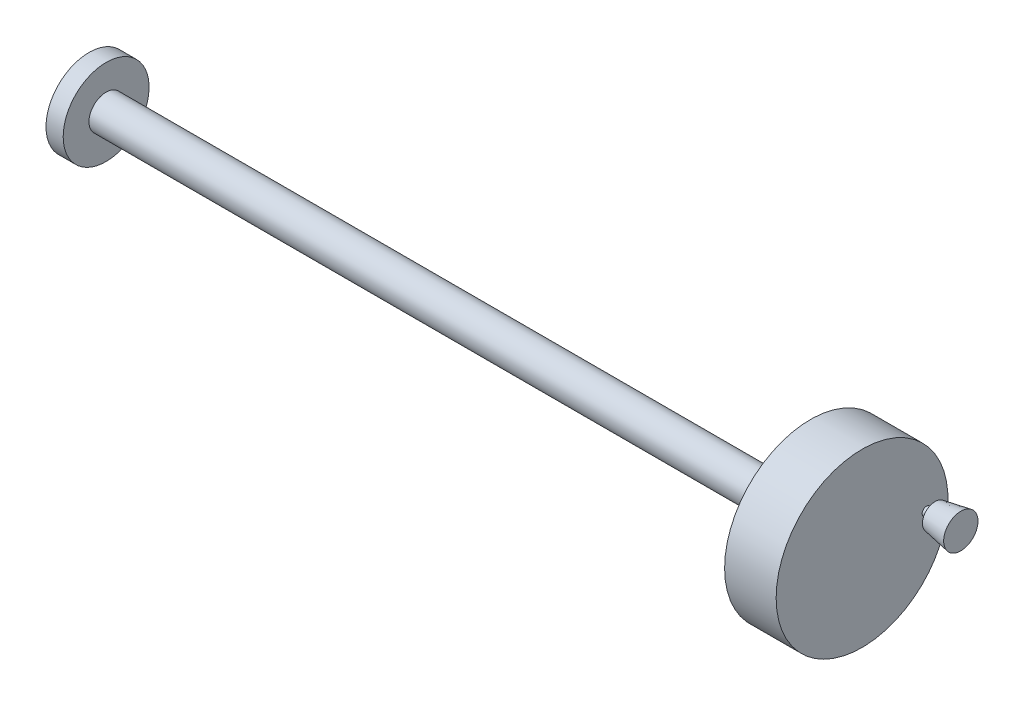
ISO-10303-21;
HEADER;
FILE_DESCRIPTION(('STEP AP214'),'2;1');
FILE_NAME('part.step','',(''),(''),'','','');
FILE_SCHEMA(('AUTOMOTIVE_DESIGN { 1 0 10303 214 1 1 1 1 }'));
ENDSEC;
DATA;
#1=APPLICATION_CONTEXT('core data for automotive mechanical design processes');
#2=APPLICATION_PROTOCOL_DEFINITION('international standard','automotive_design',2000,#1);
#3=PRODUCT_CONTEXT('',#1,'mechanical');
#4=PRODUCT('Part','Part','',(#3));
#5=PRODUCT_RELATED_PRODUCT_CATEGORY('part','',(#4));
#6=PRODUCT_DEFINITION_FORMATION('','',#4);
#7=PRODUCT_DEFINITION_CONTEXT('part definition',#1,'design');
#8=PRODUCT_DEFINITION('design','',#6,#7);
#9=PRODUCT_DEFINITION_SHAPE('','',#8);
#10=(LENGTH_UNIT() NAMED_UNIT(*) SI_UNIT(.MILLI.,.METRE.));
#11=(NAMED_UNIT(*) PLANE_ANGLE_UNIT() SI_UNIT($,.RADIAN.));
#12=(NAMED_UNIT(*) SI_UNIT($,.STERADIAN.) SOLID_ANGLE_UNIT());
#13=UNCERTAINTY_MEASURE_WITH_UNIT(LENGTH_MEASURE(1.E-05),#10,'distance_accuracy_value','');
#14=(GEOMETRIC_REPRESENTATION_CONTEXT(3) GLOBAL_UNCERTAINTY_ASSIGNED_CONTEXT((#13)) GLOBAL_UNIT_ASSIGNED_CONTEXT((#10,
#11,#12)) REPRESENTATION_CONTEXT('',''));
#15=CARTESIAN_POINT('',(0.,0.,0.));
#16=DIRECTION('',(0.,0.,1.));
#17=DIRECTION('',(1.,0.,0.));
#18=AXIS2_PLACEMENT_3D('',#15,#16,#17);
#19=CARTESIAN_POINT('',(330.2,0.,-47.625));
#20=DIRECTION('',(-1.,0.,0.));
#21=DIRECTION('',(0.,0.,1.));
#22=AXIS2_PLACEMENT_3D('',#19,#20,#21);
#23=CYLINDRICAL_SURFACE('',#22,3.175);
#24=CARTESIAN_POINT('',(304.8,0.,-47.625));
#25=DIRECTION('',(-1.,0.,0.));
#26=DIRECTION('',(0.,0.,1.));
#27=AXIS2_PLACEMENT_3D('',#24,#25,#26);
#28=CIRCLE('',#27,3.175);
#29=CARTESIAN_POINT('',(304.8,0.,-44.45));
#30=VERTEX_POINT('',#29);
#31=EDGE_CURVE('E37',#30,#30,#28,.F.);
#32=ORIENTED_EDGE('',*,*,#31,.T.);
#33=EDGE_LOOP('',(#32));
#34=FACE_BOUND('',#33,.T.);
#35=CARTESIAN_POINT('',(311.15,0.,-47.625));
#36=DIRECTION('',(1.,0.,0.));
#37=DIRECTION('',(0.,0.,-1.));
#38=AXIS2_PLACEMENT_3D('',#35,#36,#37);
#39=CIRCLE('',#38,3.175);
#40=CARTESIAN_POINT('',(311.15,0.,-50.8));
#41=VERTEX_POINT('',#40);
#42=EDGE_CURVE('E10',#41,#41,#39,.T.);
#43=ORIENTED_EDGE('',*,*,#42,.F.);
#44=EDGE_LOOP('',(#43));
#45=FACE_BOUND('',#44,.T.);
#46=ADVANCED_FACE('F30',(#34,#45),#23,.T.);
#47=CARTESIAN_POINT('',(304.8,0.,0.));
#48=DIRECTION('',(-1.,0.,0.));
#49=DIRECTION('',(0.,0.,1.));
#50=AXIS2_PLACEMENT_3D('',#47,#48,#49);
#51=PLANE('',#50);
#52=CARTESIAN_POINT('',(304.8,0.,0.));
#53=DIRECTION('',(-1.,0.,0.));
#54=DIRECTION('',(0.,0.,1.));
#55=AXIS2_PLACEMENT_3D('',#52,#53,#54);
#56=CIRCLE('',#55,63.5);
#57=CARTESIAN_POINT('',(304.8,0.,63.5));
#58=VERTEX_POINT('',#57);
#59=EDGE_CURVE('E41',#58,#58,#56,.T.);
#60=ORIENTED_EDGE('',*,*,#59,.F.);
#61=EDGE_LOOP('',(#60));
#62=FACE_BOUND('',#61,.T.);
#63=ORIENTED_EDGE('',*,*,#31,.F.);
#64=EDGE_LOOP('',(#63));
#65=FACE_BOUND('',#64,.T.);
#66=ADVANCED_FACE('F93',(#62,#65),#51,.F.);
#67=CARTESIAN_POINT('',(-266.7,0.,-31.75));
#68=DIRECTION('',(1.,0.,0.));
#69=DIRECTION('',(0.,0.,-1.));
#70=AXIS2_PLACEMENT_3D('',#67,#68,#69);
#71=PLANE('',#70);
#72=CARTESIAN_POINT('',(-266.7,0.,0.));
#73=DIRECTION('',(-1.,0.,0.));
#74=DIRECTION('',(0.,0.,1.));
#75=AXIS2_PLACEMENT_3D('',#72,#73,#74);
#76=CIRCLE('',#75,31.75);
#77=CARTESIAN_POINT('',(-266.7,0.,31.75));
#78=VERTEX_POINT('',#77);
#79=EDGE_CURVE('E65',#78,#78,#76,.T.);
#80=ORIENTED_EDGE('',*,*,#79,.T.);
#81=EDGE_LOOP('',(#80));
#82=FACE_BOUND('',#81,.T.);
#83=ADVANCED_FACE('F32',(#82),#71,.F.);
#84=CARTESIAN_POINT('',(-266.7,0.,0.));
#85=DIRECTION('',(-1.,0.,0.));
#86=DIRECTION('',(0.,0.,1.));
#87=AXIS2_PLACEMENT_3D('',#84,#85,#86);
#88=CYLINDRICAL_SURFACE('',#87,63.5);
#89=CARTESIAN_POINT('',(266.7,0.,0.));
#90=DIRECTION('',(-1.,0.,0.));
#91=DIRECTION('',(0.,0.,1.));
#92=AXIS2_PLACEMENT_3D('',#89,#90,#91);
#93=CIRCLE('',#92,63.5);
#94=CARTESIAN_POINT('',(266.7,0.,63.5));
#95=VERTEX_POINT('',#94);
#96=EDGE_CURVE('E45',#95,#95,#93,.T.);
#97=ORIENTED_EDGE('',*,*,#96,.F.);
#98=EDGE_LOOP('',(#97));
#99=FACE_BOUND('',#98,.T.);
#100=ORIENTED_EDGE('',*,*,#59,.T.);
#101=EDGE_LOOP('',(#100));
#102=FACE_BOUND('',#101,.T.);
#103=ADVANCED_FACE('F124',(#99,#102),#88,.T.);
#104=CARTESIAN_POINT('',(266.7,0.,-63.5));
#105=DIRECTION('',(1.,0.,0.));
#106=DIRECTION('',(0.,0.,-1.));
#107=AXIS2_PLACEMENT_3D('',#104,#105,#106);
#108=PLANE('',#107);
#109=CARTESIAN_POINT('',(266.7,0.,0.));
#110=DIRECTION('',(-1.,0.,0.));
#111=DIRECTION('',(0.,0.,1.));
#112=AXIS2_PLACEMENT_3D('',#109,#110,#111);
#113=CIRCLE('',#112,25.4);
#114=CARTESIAN_POINT('',(266.7,0.,25.4));
#115=VERTEX_POINT('',#114);
#116=EDGE_CURVE('E50',#115,#115,#113,.T.);
#117=ORIENTED_EDGE('',*,*,#116,.F.);
#118=EDGE_LOOP('',(#117));
#119=FACE_BOUND('',#118,.T.);
#120=ORIENTED_EDGE('',*,*,#96,.T.);
#121=EDGE_LOOP('',(#120));
#122=FACE_BOUND('',#121,.T.);
#123=ADVANCED_FACE('F120',(#119,#122),#108,.F.);
#124=CARTESIAN_POINT('',(-266.7,0.,0.));
#125=DIRECTION('',(-1.,0.,0.));
#126=DIRECTION('',(0.,0.,1.));
#127=AXIS2_PLACEMENT_3D('',#124,#125,#126);
#128=CYLINDRICAL_SURFACE('',#127,25.4);
#129=CARTESIAN_POINT('',(254.,0.,0.));
#130=DIRECTION('',(-1.,0.,0.));
#131=DIRECTION('',(0.,0.,1.));
#132=AXIS2_PLACEMENT_3D('',#129,#130,#131);
#133=CIRCLE('',#132,25.4);
#134=CARTESIAN_POINT('',(254.,0.,25.4));
#135=VERTEX_POINT('',#134);
#136=EDGE_CURVE('E53',#135,#135,#133,.T.);
#137=ORIENTED_EDGE('',*,*,#136,.F.);
#138=EDGE_LOOP('',(#137));
#139=FACE_BOUND('',#138,.T.);
#140=ORIENTED_EDGE('',*,*,#116,.T.);
#141=EDGE_LOOP('',(#140));
#142=FACE_BOUND('',#141,.T.);
#143=ADVANCED_FACE('F116',(#139,#142),#128,.T.);
#144=CARTESIAN_POINT('',(254.,0.,-25.4));
#145=DIRECTION('',(1.,0.,0.));
#146=DIRECTION('',(0.,0.,-1.));
#147=AXIS2_PLACEMENT_3D('',#144,#145,#146);
#148=PLANE('',#147);
#149=CARTESIAN_POINT('',(254.,0.,0.));
#150=DIRECTION('',(-1.,0.,0.));
#151=DIRECTION('',(0.,0.,1.));
#152=AXIS2_PLACEMENT_3D('',#149,#150,#151);
#153=CIRCLE('',#152,12.7);
#154=CARTESIAN_POINT('',(254.,0.,12.7));
#155=VERTEX_POINT('',#154);
#156=EDGE_CURVE('E56',#155,#155,#153,.T.);
#157=ORIENTED_EDGE('',*,*,#156,.F.);
#158=EDGE_LOOP('',(#157));
#159=FACE_BOUND('',#158,.T.);
#160=ORIENTED_EDGE('',*,*,#136,.T.);
#161=EDGE_LOOP('',(#160));
#162=FACE_BOUND('',#161,.T.);
#163=ADVANCED_FACE('F112',(#159,#162),#148,.F.);
#164=CARTESIAN_POINT('',(-266.7,0.,0.));
#165=DIRECTION('',(-1.,0.,0.));
#166=DIRECTION('',(0.,0.,1.));
#167=AXIS2_PLACEMENT_3D('',#164,#165,#166);
#168=CYLINDRICAL_SURFACE('',#167,12.7);
#169=CARTESIAN_POINT('',(-254.,0.,0.));
#170=DIRECTION('',(-1.,0.,0.));
#171=DIRECTION('',(0.,0.,1.));
#172=AXIS2_PLACEMENT_3D('',#169,#170,#171);
#173=CIRCLE('',#172,12.6999999999999);
#174=CARTESIAN_POINT('',(-254.,0.,12.6999999999999));
#175=VERTEX_POINT('',#174);
#176=EDGE_CURVE('E59',#175,#175,#173,.T.);
#177=ORIENTED_EDGE('',*,*,#176,.F.);
#178=EDGE_LOOP('',(#177));
#179=FACE_BOUND('',#178,.T.);
#180=ORIENTED_EDGE('',*,*,#156,.T.);
#181=EDGE_LOOP('',(#180));
#182=FACE_BOUND('',#181,.T.);
#183=ADVANCED_FACE('F108',(#179,#182),#168,.T.);
#184=CARTESIAN_POINT('',(-254.,0.,-12.6999999999999));
#185=DIRECTION('',(-1.,0.,0.));
#186=DIRECTION('',(0.,0.,1.));
#187=AXIS2_PLACEMENT_3D('',#184,#185,#186);
#188=PLANE('',#187);
#189=CARTESIAN_POINT('',(-254.,0.,0.));
#190=DIRECTION('',(-1.,0.,0.));
#191=DIRECTION('',(0.,0.,1.));
#192=AXIS2_PLACEMENT_3D('',#189,#190,#191);
#193=CIRCLE('',#192,31.75);
#194=CARTESIAN_POINT('',(-254.,0.,31.75));
#195=VERTEX_POINT('',#194);
#196=EDGE_CURVE('E62',#195,#195,#193,.T.);
#197=ORIENTED_EDGE('',*,*,#196,.F.);
#198=EDGE_LOOP('',(#197));
#199=FACE_BOUND('',#198,.T.);
#200=ORIENTED_EDGE('',*,*,#176,.T.);
#201=EDGE_LOOP('',(#200));
#202=FACE_BOUND('',#201,.T.);
#203=ADVANCED_FACE('F104',(#199,#202),#188,.F.);
#204=CARTESIAN_POINT('',(-266.7,0.,0.));
#205=DIRECTION('',(-1.,0.,0.));
#206=DIRECTION('',(0.,0.,1.));
#207=AXIS2_PLACEMENT_3D('',#204,#205,#206);
#208=CYLINDRICAL_SURFACE('',#207,31.75);
#209=ORIENTED_EDGE('',*,*,#79,.F.);
#210=EDGE_LOOP('',(#209));
#211=FACE_BOUND('',#210,.T.);
#212=ORIENTED_EDGE('',*,*,#196,.T.);
#213=EDGE_LOOP('',(#212));
#214=FACE_BOUND('',#213,.T.);
#215=ADVANCED_FACE('F89',(#211,#214),#208,.T.);
#216=CARTESIAN_POINT('',(311.15,0.,-47.625));
#217=DIRECTION('',(1.,0.,0.));
#218=DIRECTION('',(0.,0.,-1.));
#219=AXIS2_PLACEMENT_3D('',#216,#217,#218);
#220=PLANE('',#219);
#221=CARTESIAN_POINT('',(311.15,0.,-47.625));
#222=DIRECTION('',(1.,0.,0.));
#223=DIRECTION('',(0.,0.,-1.));
#224=AXIS2_PLACEMENT_3D('',#221,#222,#223);
#225=CIRCLE('',#224,9.34097101750374);
#226=CARTESIAN_POINT('',(311.15,0.,-56.9659710175037));
#227=VERTEX_POINT('',#226);
#228=EDGE_CURVE('E68',#227,#227,#225,.T.);
#229=ORIENTED_EDGE('',*,*,#228,.F.);
#230=EDGE_LOOP('',(#229));
#231=FACE_BOUND('',#230,.T.);
#232=ORIENTED_EDGE('',*,*,#42,.T.);
#233=EDGE_LOOP('',(#232));
#234=FACE_BOUND('',#233,.T.);
#235=ADVANCED_FACE('F79',(#231,#234),#220,.F.);
#236=CARTESIAN_POINT('',(330.2,0.,-47.625));
#237=DIRECTION('',(1.,0.,0.));
#238=DIRECTION('',(0.,0.,-1.));
#239=AXIS2_PLACEMENT_3D('',#236,#237,#238);
#240=CONICAL_SURFACE('',#239,12.7,0.174532925199433);
#241=ORIENTED_EDGE('',*,*,#228,.T.);
#242=EDGE_LOOP('',(#241));
#243=FACE_BOUND('',#242,.T.);
#244=CARTESIAN_POINT('',(330.2,0.,-47.625));
#245=DIRECTION('',(1.,0.,0.));
#246=DIRECTION('',(0.,0.,-1.));
#247=AXIS2_PLACEMENT_3D('',#244,#245,#246);
#248=CIRCLE('',#247,12.7);
#249=CARTESIAN_POINT('',(330.2,0.,-60.325));
#250=VERTEX_POINT('',#249);
#251=EDGE_CURVE('E71',#250,#250,#248,.T.);
#252=ORIENTED_EDGE('',*,*,#251,.F.);
#253=EDGE_LOOP('',(#252));
#254=FACE_BOUND('',#253,.T.);
#255=ADVANCED_FACE('F77',(#243,#254),#240,.T.);
#256=CARTESIAN_POINT('',(330.2,0.,-47.625));
#257=DIRECTION('',(1.,0.,0.));
#258=DIRECTION('',(0.,0.,-1.));
#259=AXIS2_PLACEMENT_3D('',#256,#257,#258);
#260=PLANE('',#259);
#261=ORIENTED_EDGE('',*,*,#251,.T.);
#262=EDGE_LOOP('',(#261));
#263=FACE_BOUND('',#262,.T.);
#264=ADVANCED_FACE('F75',(#263),#260,.T.);
#265=CLOSED_SHELL('',(#46,#66,#83,#103,#123,#143,#163,#183,#203,#215,#235,#255,#264));
#266=MANIFOLD_SOLID_BREP('B2',#265);
#267=ADVANCED_BREP_SHAPE_REPRESENTATION('',(#18,#266),#14);
#268=SHAPE_DEFINITION_REPRESENTATION(#9,#267);
ENDSEC;
END-ISO-10303-21;
